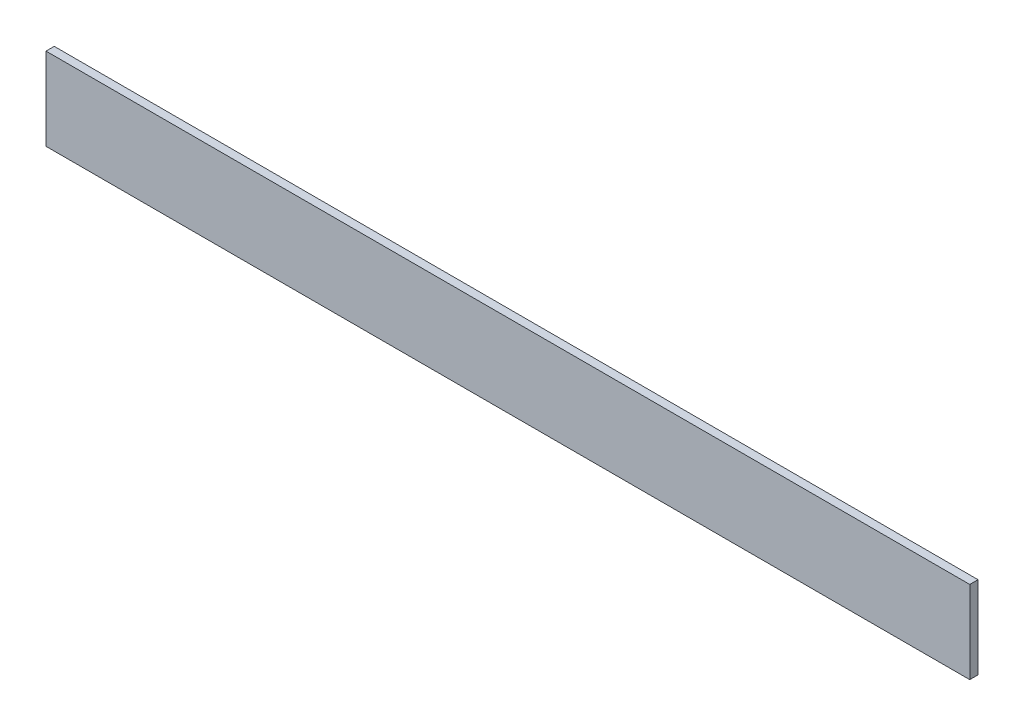
ISO-10303-21;
HEADER;
FILE_DESCRIPTION(('STEP AP214'),'2;1');
FILE_NAME('part.step','',(''),(''),'','','');
FILE_SCHEMA(('AUTOMOTIVE_DESIGN { 1 0 10303 214 1 1 1 1 }'));
ENDSEC;
DATA;
#1=APPLICATION_CONTEXT('core data for automotive mechanical design processes');
#2=APPLICATION_PROTOCOL_DEFINITION('international standard','automotive_design',2000,#1);
#3=PRODUCT_CONTEXT('',#1,'mechanical');
#4=PRODUCT('Part','Part','',(#3));
#5=PRODUCT_RELATED_PRODUCT_CATEGORY('part','',(#4));
#6=PRODUCT_DEFINITION_FORMATION('','',#4);
#7=PRODUCT_DEFINITION_CONTEXT('part definition',#1,'design');
#8=PRODUCT_DEFINITION('design','',#6,#7);
#9=PRODUCT_DEFINITION_SHAPE('','',#8);
#10=(LENGTH_UNIT() NAMED_UNIT(*) SI_UNIT(.MILLI.,.METRE.));
#11=(NAMED_UNIT(*) PLANE_ANGLE_UNIT() SI_UNIT($,.RADIAN.));
#12=(NAMED_UNIT(*) SI_UNIT($,.STERADIAN.) SOLID_ANGLE_UNIT());
#13=UNCERTAINTY_MEASURE_WITH_UNIT(LENGTH_MEASURE(1.E-05),#10,'distance_accuracy_value','');
#14=(GEOMETRIC_REPRESENTATION_CONTEXT(3) GLOBAL_UNCERTAINTY_ASSIGNED_CONTEXT((#13)) GLOBAL_UNIT_ASSIGNED_CONTEXT((#10,
#11,#12)) REPRESENTATION_CONTEXT('',''));
#15=CARTESIAN_POINT('',(0.,0.,0.));
#16=DIRECTION('',(0.,0.,1.));
#17=DIRECTION('',(1.,0.,0.));
#18=AXIS2_PLACEMENT_3D('',#15,#16,#17);
#19=CARTESIAN_POINT('',(0.,0.,0.));
#20=DIRECTION('',(0.,0.,1.));
#21=DIRECTION('',(1.,0.,0.));
#22=AXIS2_PLACEMENT_3D('',#19,#20,#21);
#23=PLANE('',#22);
#24=DIRECTION('',(1.,0.,0.));
#25=VECTOR('',#24,1.);
#26=CARTESIAN_POINT('',(5.6,0.5,0.));
#27=LINE('',#26,#25);
#28=CARTESIAN_POINT('',(5.6,0.5,0.));
#29=VERTEX_POINT('',#28);
#30=CARTESIAN_POINT('',(-5.6,0.5,0.));
#31=VERTEX_POINT('',#30);
#32=EDGE_CURVE('E79',#29,#31,#27,.F.);
#33=ORIENTED_EDGE('',*,*,#32,.F.);
#34=DIRECTION('',(0.,1.,0.));
#35=VECTOR('',#34,1.);
#36=CARTESIAN_POINT('',(5.6,-0.5,0.));
#37=LINE('',#36,#35);
#38=CARTESIAN_POINT('',(5.6,-0.5,0.));
#39=VERTEX_POINT('',#38);
#40=EDGE_CURVE('E55',#39,#29,#37,.T.);
#41=ORIENTED_EDGE('',*,*,#40,.F.);
#42=DIRECTION('',(1.,0.,0.));
#43=VECTOR('',#42,1.);
#44=CARTESIAN_POINT('',(-5.6,-0.5,0.));
#45=LINE('',#44,#43);
#46=CARTESIAN_POINT('',(-5.6,-0.5,0.));
#47=VERTEX_POINT('',#46);
#48=EDGE_CURVE('E57',#47,#39,#45,.T.);
#49=ORIENTED_EDGE('',*,*,#48,.F.);
#50=DIRECTION('',(0.,1.,0.));
#51=VECTOR('',#50,1.);
#52=CARTESIAN_POINT('',(-5.6,0.5,0.));
#53=LINE('',#52,#51);
#54=EDGE_CURVE('E20',#31,#47,#53,.F.);
#55=ORIENTED_EDGE('',*,*,#54,.F.);
#56=EDGE_LOOP('',(#33,#41,#49,#55));
#57=FACE_BOUND('',#56,.T.);
#58=ADVANCED_FACE('F17',(#57),#23,.F.);
#59=CARTESIAN_POINT('',(-5.6,0.5,0.));
#60=DIRECTION('',(-1.,0.,0.));
#61=DIRECTION('',(0.,0.,1.));
#62=AXIS2_PLACEMENT_3D('',#59,#60,#61);
#63=PLANE('',#62);
#64=DIRECTION('',(0.,1.,0.));
#65=VECTOR('',#64,1.);
#66=CARTESIAN_POINT('',(-5.6,0.,0.1));
#67=LINE('',#66,#65);
#68=CARTESIAN_POINT('',(-5.6,0.5,0.1));
#69=VERTEX_POINT('',#68);
#70=CARTESIAN_POINT('',(-5.6,-0.5,0.1));
#71=VERTEX_POINT('',#70);
#72=EDGE_CURVE('E83',#69,#71,#67,.F.);
#73=ORIENTED_EDGE('',*,*,#72,.F.);
#74=DIRECTION('',(0.,0.,1.));
#75=VECTOR('',#74,1.);
#76=CARTESIAN_POINT('',(-5.6,0.5,0.));
#77=LINE('',#76,#75);
#78=EDGE_CURVE('E68',#31,#69,#77,.T.);
#79=ORIENTED_EDGE('',*,*,#78,.F.);
#80=ORIENTED_EDGE('',*,*,#54,.T.);
#81=DIRECTION('',(0.,0.,-1.));
#82=VECTOR('',#81,1.);
#83=CARTESIAN_POINT('',(-5.6,-0.5,0.));
#84=LINE('',#83,#82);
#85=EDGE_CURVE('E63',#71,#47,#84,.T.);
#86=ORIENTED_EDGE('',*,*,#85,.F.);
#87=EDGE_LOOP('',(#73,#79,#80,#86));
#88=FACE_BOUND('',#87,.T.);
#89=ADVANCED_FACE('F65',(#88),#63,.T.);
#90=CARTESIAN_POINT('',(-5.6,-0.5,0.));
#91=DIRECTION('',(0.,-1.,0.));
#92=DIRECTION('',(0.,0.,-1.));
#93=AXIS2_PLACEMENT_3D('',#90,#91,#92);
#94=PLANE('',#93);
#95=DIRECTION('',(1.,0.,0.));
#96=VECTOR('',#95,1.);
#97=CARTESIAN_POINT('',(0.,-0.5,0.1));
#98=LINE('',#97,#96);
#99=CARTESIAN_POINT('',(5.6,-0.5,0.1));
#100=VERTEX_POINT('',#99);
#101=EDGE_CURVE('E72',#71,#100,#98,.T.);
#102=ORIENTED_EDGE('',*,*,#101,.F.);
#103=ORIENTED_EDGE('',*,*,#85,.T.);
#104=ORIENTED_EDGE('',*,*,#48,.T.);
#105=DIRECTION('',(0.,0.,-1.));
#106=VECTOR('',#105,1.);
#107=CARTESIAN_POINT('',(5.6,-0.5,0.));
#108=LINE('',#107,#106);
#109=EDGE_CURVE('E75',#100,#39,#108,.T.);
#110=ORIENTED_EDGE('',*,*,#109,.F.);
#111=EDGE_LOOP('',(#102,#103,#104,#110));
#112=FACE_BOUND('',#111,.T.);
#113=ADVANCED_FACE('F70',(#112),#94,.T.);
#114=CARTESIAN_POINT('',(5.6,-0.5,0.));
#115=DIRECTION('',(1.,0.,0.));
#116=DIRECTION('',(0.,0.,-1.));
#117=AXIS2_PLACEMENT_3D('',#114,#115,#116);
#118=PLANE('',#117);
#119=DIRECTION('',(0.,1.,0.));
#120=VECTOR('',#119,1.);
#121=CARTESIAN_POINT('',(5.6,0.,0.1));
#122=LINE('',#121,#120);
#123=CARTESIAN_POINT('',(5.6,0.5,0.1));
#124=VERTEX_POINT('',#123);
#125=EDGE_CURVE('E26',#100,#124,#122,.T.);
#126=ORIENTED_EDGE('',*,*,#125,.F.);
#127=ORIENTED_EDGE('',*,*,#109,.T.);
#128=ORIENTED_EDGE('',*,*,#40,.T.);
#129=DIRECTION('',(0.,0.,1.));
#130=VECTOR('',#129,1.);
#131=CARTESIAN_POINT('',(5.6,0.5,0.));
#132=LINE('',#131,#130);
#133=EDGE_CURVE('E35',#124,#29,#132,.F.);
#134=ORIENTED_EDGE('',*,*,#133,.F.);
#135=EDGE_LOOP('',(#126,#127,#128,#134));
#136=FACE_BOUND('',#135,.T.);
#137=ADVANCED_FACE('F89',(#136),#118,.T.);
#138=CARTESIAN_POINT('',(5.6,0.5,0.));
#139=DIRECTION('',(0.,1.,0.));
#140=DIRECTION('',(0.,0.,1.));
#141=AXIS2_PLACEMENT_3D('',#138,#139,#140);
#142=PLANE('',#141);
#143=DIRECTION('',(1.,0.,0.));
#144=VECTOR('',#143,1.);
#145=CARTESIAN_POINT('',(0.,0.5,0.1));
#146=LINE('',#145,#144);
#147=EDGE_CURVE('E11',#124,#69,#146,.F.);
#148=ORIENTED_EDGE('',*,*,#147,.F.);
#149=ORIENTED_EDGE('',*,*,#133,.T.);
#150=ORIENTED_EDGE('',*,*,#32,.T.);
#151=ORIENTED_EDGE('',*,*,#78,.T.);
#152=EDGE_LOOP('',(#148,#149,#150,#151));
#153=FACE_BOUND('',#152,.T.);
#154=ADVANCED_FACE('F91',(#153),#142,.T.);
#155=CARTESIAN_POINT('',(0.,0.,0.1));
#156=DIRECTION('',(0.,0.,1.));
#157=DIRECTION('',(1.,0.,0.));
#158=AXIS2_PLACEMENT_3D('',#155,#156,#157);
#159=PLANE('',#158);
#160=ORIENTED_EDGE('',*,*,#125,.T.);
#161=ORIENTED_EDGE('',*,*,#147,.T.);
#162=ORIENTED_EDGE('',*,*,#72,.T.);
#163=ORIENTED_EDGE('',*,*,#101,.T.);
#164=EDGE_LOOP('',(#160,#161,#162,#163));
#165=FACE_BOUND('',#164,.T.);
#166=ADVANCED_FACE('F88',(#165),#159,.T.);
#167=CLOSED_SHELL('',(#58,#89,#113,#137,#154,#166));
#168=MANIFOLD_SOLID_BREP('B1',#167);
#169=ADVANCED_BREP_SHAPE_REPRESENTATION('',(#18,#168),#14);
#170=SHAPE_DEFINITION_REPRESENTATION(#9,#169);
ENDSEC;
END-ISO-10303-21;
